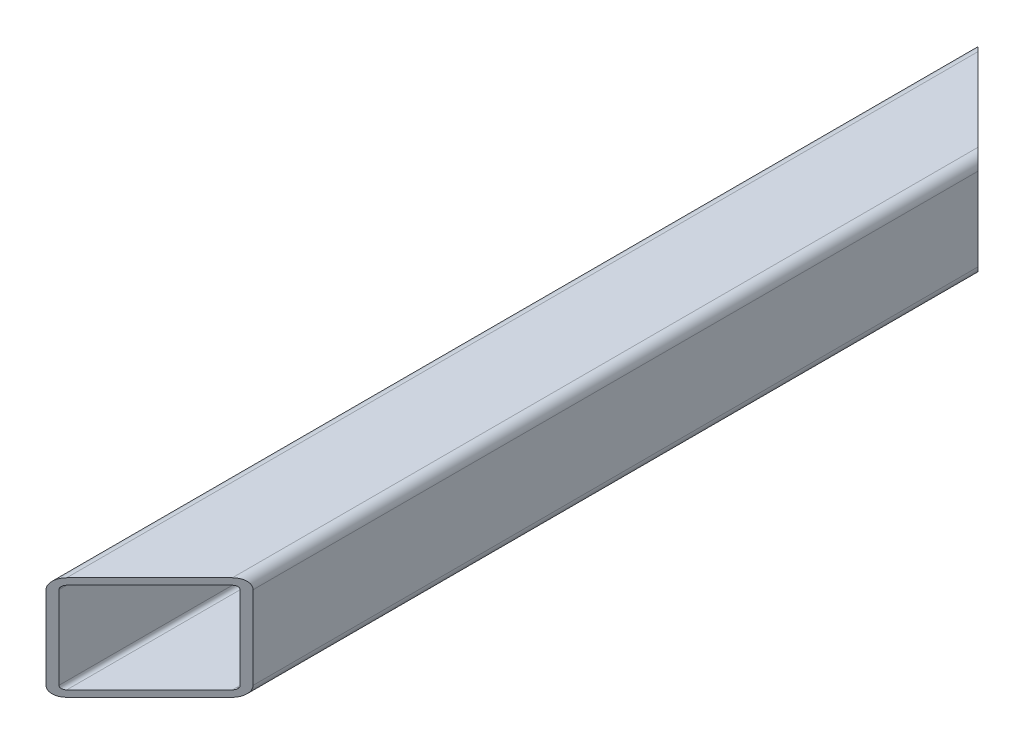
ISO-10303-21;
HEADER;
FILE_DESCRIPTION(('STEP AP214'),'2;1');
FILE_NAME('part.step','',(''),(''),'','','');
FILE_SCHEMA(('AUTOMOTIVE_DESIGN { 1 0 10303 214 1 1 1 1 }'));
ENDSEC;
DATA;
#1=APPLICATION_CONTEXT('core data for automotive mechanical design processes');
#2=APPLICATION_PROTOCOL_DEFINITION('international standard','automotive_design',2000,#1);
#3=PRODUCT_CONTEXT('',#1,'mechanical');
#4=PRODUCT('Part','Part','',(#3));
#5=PRODUCT_RELATED_PRODUCT_CATEGORY('part','',(#4));
#6=PRODUCT_DEFINITION_FORMATION('','',#4);
#7=PRODUCT_DEFINITION_CONTEXT('part definition',#1,'design');
#8=PRODUCT_DEFINITION('design','',#6,#7);
#9=PRODUCT_DEFINITION_SHAPE('','',#8);
#10=(LENGTH_UNIT() NAMED_UNIT(*) SI_UNIT(.MILLI.,.METRE.));
#11=(NAMED_UNIT(*) PLANE_ANGLE_UNIT() SI_UNIT($,.RADIAN.));
#12=(NAMED_UNIT(*) SI_UNIT($,.STERADIAN.) SOLID_ANGLE_UNIT());
#13=UNCERTAINTY_MEASURE_WITH_UNIT(LENGTH_MEASURE(1.E-05),#10,'distance_accuracy_value','');
#14=(GEOMETRIC_REPRESENTATION_CONTEXT(3) GLOBAL_UNCERTAINTY_ASSIGNED_CONTEXT((#13)) GLOBAL_UNIT_ASSIGNED_CONTEXT((#10,
#11,#12)) REPRESENTATION_CONTEXT('',''));
#15=CARTESIAN_POINT('',(0.,0.,0.));
#16=DIRECTION('',(0.,0.,1.));
#17=DIRECTION('',(1.,0.,0.));
#18=AXIS2_PLACEMENT_3D('',#15,#16,#17);
#19=CARTESIAN_POINT('',(8.,8.,-720.));
#20=DIRECTION('',(0.,0.,1.));
#21=DIRECTION('',(1.,0.,0.));
#22=AXIS2_PLACEMENT_3D('',#19,#20,#21);
#23=CYLINDRICAL_SURFACE('',#22,8.);
#24=CARTESIAN_POINT('',(8.,8.,-712.));
#25=DIRECTION('',(-0.707106781186548,0.,0.707106781186547));
#26=DIRECTION('',(0.707106781186547,0.,0.707106781186548));
#27=AXIS2_PLACEMENT_3D('',#24,#25,#26);
#28=ELLIPSE('',#27,11.3137084989848,8.);
#29=CARTESIAN_POINT('',(8.00000000000002,0.,-712.));
#30=VERTEX_POINT('',#29);
#31=CARTESIAN_POINT('',(0.,8.00000000000006,-720.));
#32=VERTEX_POINT('',#31);
#33=EDGE_CURVE('E151',#30,#32,#28,.F.);
#34=ORIENTED_EDGE('',*,*,#33,.F.);
#35=DIRECTION('',(0.,0.,1.));
#36=VECTOR('',#35,1.);
#37=CARTESIAN_POINT('',(8.00000000000006,0.,-720.));
#38=LINE('',#37,#36);
#39=CARTESIAN_POINT('',(8.00000000000001,0.,-8.00000000000004));
#40=VERTEX_POINT('',#39);
#41=EDGE_CURVE('E156',#30,#40,#38,.T.);
#42=ORIENTED_EDGE('',*,*,#41,.T.);
#43=CARTESIAN_POINT('',(8.,8.,-8.00000000000012));
#44=DIRECTION('',(-0.707106781186548,0.,-0.707106781186547));
#45=DIRECTION('',(-0.707106781186547,0.,0.707106781186548));
#46=AXIS2_PLACEMENT_3D('',#43,#44,#45);
#47=ELLIPSE('',#46,11.3137084989848,8.);
#48=CARTESIAN_POINT('',(0.,8.,0.));
#49=VERTEX_POINT('',#48);
#50=EDGE_CURVE('E217',#49,#40,#47,.F.);
#51=ORIENTED_EDGE('',*,*,#50,.F.);
#52=DIRECTION('',(0.,0.,1.));
#53=VECTOR('',#52,1.);
#54=CARTESIAN_POINT('',(0.,8.00000000000006,-720.));
#55=LINE('',#54,#53);
#56=EDGE_CURVE('E170',#32,#49,#55,.T.);
#57=ORIENTED_EDGE('',*,*,#56,.F.);
#58=EDGE_LOOP('',(#34,#42,#51,#57));
#59=FACE_BOUND('',#58,.T.);
#60=ADVANCED_FACE('F33',(#59),#23,.T.);
#61=CARTESIAN_POINT('',(0.,8.00000000000006,-720.));
#62=DIRECTION('',(-1.,0.,0.));
#63=DIRECTION('',(0.,0.,1.));
#64=AXIS2_PLACEMENT_3D('',#61,#62,#63);
#65=PLANE('',#64);
#66=DIRECTION('',(0.,-1.,0.));
#67=VECTOR('',#66,1.);
#68=CARTESIAN_POINT('',(0.,8.00000000000006,0.));
#69=LINE('',#68,#67);
#70=CARTESIAN_POINT('',(0.,71.9999999999999,0.));
#71=VERTEX_POINT('',#70);
#72=EDGE_CURVE('E157',#71,#49,#69,.T.);
#73=ORIENTED_EDGE('',*,*,#72,.F.);
#74=DIRECTION('',(0.,0.,1.));
#75=VECTOR('',#74,1.);
#76=CARTESIAN_POINT('',(0.,71.9999999999999,-720.));
#77=LINE('',#76,#75);
#78=CARTESIAN_POINT('',(0.,71.9999999999999,-720.));
#79=VERTEX_POINT('',#78);
#80=EDGE_CURVE('E164',#79,#71,#77,.T.);
#81=ORIENTED_EDGE('',*,*,#80,.F.);
#82=DIRECTION('',(0.,-1.,0.));
#83=VECTOR('',#82,1.);
#84=CARTESIAN_POINT('',(0.,8.00000000000006,-720.));
#85=LINE('',#84,#83);
#86=EDGE_CURVE('E145',#79,#32,#85,.T.);
#87=ORIENTED_EDGE('',*,*,#86,.T.);
#88=ORIENTED_EDGE('',*,*,#56,.T.);
#89=EDGE_LOOP('',(#73,#81,#87,#88));
#90=FACE_BOUND('',#89,.T.);
#91=ADVANCED_FACE('F169',(#90),#65,.T.);
#92=CARTESIAN_POINT('',(8.,72.,-720.));
#93=DIRECTION('',(0.,0.,1.));
#94=DIRECTION('',(1.,0.,0.));
#95=AXIS2_PLACEMENT_3D('',#92,#93,#94);
#96=CYLINDRICAL_SURFACE('',#95,8.);
#97=CARTESIAN_POINT('',(8.,72.,-712.));
#98=DIRECTION('',(-0.707106781186548,0.,0.707106781186547));
#99=DIRECTION('',(0.707106781186547,0.,0.707106781186548));
#100=AXIS2_PLACEMENT_3D('',#97,#98,#99);
#101=ELLIPSE('',#100,11.3137084989848,8.);
#102=CARTESIAN_POINT('',(8.00000000000002,80.,-712.));
#103=VERTEX_POINT('',#102);
#104=EDGE_CURVE('E148',#79,#103,#101,.F.);
#105=ORIENTED_EDGE('',*,*,#104,.F.);
#106=ORIENTED_EDGE('',*,*,#80,.T.);
#107=CARTESIAN_POINT('',(8.,72.,-7.9999999999999));
#108=DIRECTION('',(-0.707106781186548,0.,-0.707106781186547));
#109=DIRECTION('',(-0.707106781186547,0.,0.707106781186548));
#110=AXIS2_PLACEMENT_3D('',#107,#108,#109);
#111=ELLIPSE('',#110,11.3137084989848,8.);
#112=CARTESIAN_POINT('',(8.00000000000002,80.,-8.00000000000004));
#113=VERTEX_POINT('',#112);
#114=EDGE_CURVE('E215',#113,#71,#111,.F.);
#115=ORIENTED_EDGE('',*,*,#114,.F.);
#116=DIRECTION('',(0.,0.,1.));
#117=VECTOR('',#116,1.);
#118=CARTESIAN_POINT('',(8.00000000000006,80.,-720.));
#119=LINE('',#118,#117);
#120=EDGE_CURVE('E166',#103,#113,#119,.T.);
#121=ORIENTED_EDGE('',*,*,#120,.F.);
#122=EDGE_LOOP('',(#105,#106,#115,#121));
#123=FACE_BOUND('',#122,.T.);
#124=ADVANCED_FACE('F162',(#123),#96,.T.);
#125=CARTESIAN_POINT('',(8.00000000000006,80.,-720.));
#126=DIRECTION('',(0.,1.,0.));
#127=DIRECTION('',(-1.,0.,0.));
#128=AXIS2_PLACEMENT_3D('',#125,#126,#127);
#129=PLANE('',#128);
#130=DIRECTION('',(0.707106781186547,0.,0.707106781186548));
#131=VECTOR('',#130,1.);
#132=CARTESIAN_POINT('',(80.,80.,-640.));
#133=LINE('',#132,#131);
#134=CARTESIAN_POINT('',(72.,80.,-648.));
#135=VERTEX_POINT('',#134);
#136=EDGE_CURVE('E308',#103,#135,#133,.T.);
#137=ORIENTED_EDGE('',*,*,#136,.F.);
#138=ORIENTED_EDGE('',*,*,#120,.T.);
#139=DIRECTION('',(-0.707106781186547,0.,0.707106781186548));
#140=VECTOR('',#139,1.);
#141=CARTESIAN_POINT('',(80.,80.,-80.));
#142=LINE('',#141,#140);
#143=CARTESIAN_POINT('',(72.0000000000001,80.,-72.0000000000004));
#144=VERTEX_POINT('',#143);
#145=EDGE_CURVE('E247',#144,#113,#142,.T.);
#146=ORIENTED_EDGE('',*,*,#145,.F.);
#147=DIRECTION('',(0.,0.,1.));
#148=VECTOR('',#147,1.);
#149=CARTESIAN_POINT('',(71.9999999999999,80.,-720.));
#150=LINE('',#149,#148);
#151=EDGE_CURVE('E173',#135,#144,#150,.T.);
#152=ORIENTED_EDGE('',*,*,#151,.F.);
#153=EDGE_LOOP('',(#137,#138,#146,#152));
#154=FACE_BOUND('',#153,.T.);
#155=ADVANCED_FACE('F320',(#154),#129,.T.);
#156=CARTESIAN_POINT('',(72.,72.,-720.));
#157=DIRECTION('',(0.,0.,1.));
#158=DIRECTION('',(1.,0.,0.));
#159=AXIS2_PLACEMENT_3D('',#156,#157,#158);
#160=CYLINDRICAL_SURFACE('',#159,8.00000000000001);
#161=CARTESIAN_POINT('',(72.,72.,-648.));
#162=DIRECTION('',(-0.707106781186548,0.,0.707106781186547));
#163=DIRECTION('',(0.707106781186547,0.,0.707106781186548));
#164=AXIS2_PLACEMENT_3D('',#161,#162,#163);
#165=ELLIPSE('',#164,11.3137084989848,8.00000000000001);
#166=CARTESIAN_POINT('',(80.,71.9999999999999,-640.));
#167=VERTEX_POINT('',#166);
#168=EDGE_CURVE('E167',#135,#167,#165,.F.);
#169=ORIENTED_EDGE('',*,*,#168,.F.);
#170=ORIENTED_EDGE('',*,*,#151,.T.);
#171=CARTESIAN_POINT('',(72.,72.,-72.0000000000001));
#172=DIRECTION('',(-0.707106781186548,0.,-0.707106781186547));
#173=DIRECTION('',(-0.707106781186547,0.,0.707106781186548));
#174=AXIS2_PLACEMENT_3D('',#171,#172,#173);
#175=ELLIPSE('',#174,11.3137084989848,8.00000000000001);
#176=CARTESIAN_POINT('',(80.,71.9999999999999,-80.));
#177=VERTEX_POINT('',#176);
#178=EDGE_CURVE('E207',#177,#144,#175,.F.);
#179=ORIENTED_EDGE('',*,*,#178,.F.);
#180=DIRECTION('',(0.,0.,1.));
#181=VECTOR('',#180,1.);
#182=CARTESIAN_POINT('',(80.,71.9999999999999,-720.));
#183=LINE('',#182,#181);
#184=EDGE_CURVE('E178',#167,#177,#183,.T.);
#185=ORIENTED_EDGE('',*,*,#184,.F.);
#186=EDGE_LOOP('',(#169,#170,#179,#185));
#187=FACE_BOUND('',#186,.T.);
#188=ADVANCED_FACE('F317',(#187),#160,.T.);
#189=CARTESIAN_POINT('',(80.,8.00000000000006,-720.));
#190=DIRECTION('',(1.,0.,0.));
#191=DIRECTION('',(0.,1.,0.));
#192=AXIS2_PLACEMENT_3D('',#189,#190,#191);
#193=PLANE('',#192);
#194=DIRECTION('',(0.,1.,0.));
#195=VECTOR('',#194,1.);
#196=CARTESIAN_POINT('',(80.,0.,-640.));
#197=LINE('',#196,#195);
#198=CARTESIAN_POINT('',(80.,8.,-640.));
#199=VERTEX_POINT('',#198);
#200=EDGE_CURVE('E289',#199,#167,#197,.T.);
#201=ORIENTED_EDGE('',*,*,#200,.T.);
#202=ORIENTED_EDGE('',*,*,#184,.T.);
#203=DIRECTION('',(0.,1.,0.));
#204=VECTOR('',#203,1.);
#205=CARTESIAN_POINT('',(79.9999999999999,0.,-80.));
#206=LINE('',#205,#204);
#207=CARTESIAN_POINT('',(79.9999999999999,8.,-80.));
#208=VERTEX_POINT('',#207);
#209=EDGE_CURVE('E246',#208,#177,#206,.T.);
#210=ORIENTED_EDGE('',*,*,#209,.F.);
#211=DIRECTION('',(0.,0.,1.));
#212=VECTOR('',#211,1.);
#213=CARTESIAN_POINT('',(80.,8.00000000000006,-720.));
#214=LINE('',#213,#212);
#215=EDGE_CURVE('E180',#199,#208,#214,.T.);
#216=ORIENTED_EDGE('',*,*,#215,.F.);
#217=EDGE_LOOP('',(#201,#202,#210,#216));
#218=FACE_BOUND('',#217,.T.);
#219=ADVANCED_FACE('F314',(#218),#193,.T.);
#220=CARTESIAN_POINT('',(72.,8.,-720.));
#221=DIRECTION('',(0.,0.,1.));
#222=DIRECTION('',(1.,0.,0.));
#223=AXIS2_PLACEMENT_3D('',#220,#221,#222);
#224=CYLINDRICAL_SURFACE('',#223,8.);
#225=CARTESIAN_POINT('',(72.,8.,-648.));
#226=DIRECTION('',(-0.707106781186548,0.,0.707106781186547));
#227=DIRECTION('',(0.707106781186547,0.,0.707106781186548));
#228=AXIS2_PLACEMENT_3D('',#225,#226,#227);
#229=ELLIPSE('',#228,11.3137084989848,8.);
#230=CARTESIAN_POINT('',(72.,0.,-648.));
#231=VERTEX_POINT('',#230);
#232=EDGE_CURVE('E304',#199,#231,#229,.F.);
#233=ORIENTED_EDGE('',*,*,#232,.F.);
#234=ORIENTED_EDGE('',*,*,#215,.T.);
#235=CARTESIAN_POINT('',(72.,8.,-72.0000000000001));
#236=DIRECTION('',(-0.707106781186548,0.,-0.707106781186547));
#237=DIRECTION('',(-0.707106781186547,0.,0.707106781186548));
#238=AXIS2_PLACEMENT_3D('',#235,#236,#237);
#239=ELLIPSE('',#238,11.3137084989848,8.);
#240=CARTESIAN_POINT('',(71.9999999999999,0.,-72.));
#241=VERTEX_POINT('',#240);
#242=EDGE_CURVE('E203',#241,#208,#239,.F.);
#243=ORIENTED_EDGE('',*,*,#242,.F.);
#244=DIRECTION('',(0.,0.,1.));
#245=VECTOR('',#244,1.);
#246=CARTESIAN_POINT('',(71.9999999999999,0.,-720.));
#247=LINE('',#246,#245);
#248=EDGE_CURVE('E182',#231,#241,#247,.T.);
#249=ORIENTED_EDGE('',*,*,#248,.F.);
#250=EDGE_LOOP('',(#233,#234,#243,#249));
#251=FACE_BOUND('',#250,.T.);
#252=ADVANCED_FACE('F403',(#251),#224,.T.);
#253=CARTESIAN_POINT('',(8.00000000000006,0.,-720.));
#254=DIRECTION('',(0.,-1.,0.));
#255=DIRECTION('',(0.,0.,-1.));
#256=AXIS2_PLACEMENT_3D('',#253,#254,#255);
#257=PLANE('',#256);
#258=DIRECTION('',(0.707106781186547,0.,0.707106781186548));
#259=VECTOR('',#258,1.);
#260=CARTESIAN_POINT('',(80.,0.,-640.));
#261=LINE('',#260,#259);
#262=EDGE_CURVE('E242',#30,#231,#261,.T.);
#263=ORIENTED_EDGE('',*,*,#262,.T.);
#264=ORIENTED_EDGE('',*,*,#248,.T.);
#265=DIRECTION('',(-0.707106781186547,0.,0.707106781186548));
#266=VECTOR('',#265,1.);
#267=CARTESIAN_POINT('',(79.9999999999999,0.,-80.));
#268=LINE('',#267,#266);
#269=EDGE_CURVE('E244',#241,#40,#268,.T.);
#270=ORIENTED_EDGE('',*,*,#269,.T.);
#271=ORIENTED_EDGE('',*,*,#41,.F.);
#272=EDGE_LOOP('',(#263,#264,#270,#271));
#273=FACE_BOUND('',#272,.T.);
#274=ADVANCED_FACE('F241',(#273),#257,.T.);
#275=CARTESIAN_POINT('',(8.,8.,-720.));
#276=DIRECTION('',(0.,0.,1.));
#277=DIRECTION('',(1.,0.,0.));
#278=AXIS2_PLACEMENT_3D('',#275,#276,#277);
#279=CYLINDRICAL_SURFACE('',#278,3.);
#280=DIRECTION('',(0.,0.,1.));
#281=VECTOR('',#280,1.);
#282=CARTESIAN_POINT('',(8.00000000000006,5.,-720.));
#283=LINE('',#282,#281);
#284=CARTESIAN_POINT('',(8.00000000000004,5.,-712.));
#285=VERTEX_POINT('',#284);
#286=CARTESIAN_POINT('',(8.00000000000001,5.,-8.00000000000006));
#287=VERTEX_POINT('',#286);
#288=EDGE_CURVE('E189',#285,#287,#283,.T.);
#289=ORIENTED_EDGE('',*,*,#288,.F.);
#290=CARTESIAN_POINT('',(8.,8.,-712.));
#291=DIRECTION('',(-0.707106781186548,0.,0.707106781186547));
#292=DIRECTION('',(0.707106781186547,0.,0.707106781186548));
#293=AXIS2_PLACEMENT_3D('',#290,#291,#292);
#294=ELLIPSE('',#293,4.24264068711929,3.);
#295=CARTESIAN_POINT('',(5.,8.00000000000006,-715.));
#296=VERTEX_POINT('',#295);
#297=EDGE_CURVE('E47',#285,#296,#294,.F.);
#298=ORIENTED_EDGE('',*,*,#297,.T.);
#299=DIRECTION('',(0.,0.,1.));
#300=VECTOR('',#299,1.);
#301=CARTESIAN_POINT('',(5.,8.00000000000006,-720.));
#302=LINE('',#301,#300);
#303=CARTESIAN_POINT('',(5.,8.00000000000006,-5.));
#304=VERTEX_POINT('',#303);
#305=EDGE_CURVE('E202',#296,#304,#302,.T.);
#306=ORIENTED_EDGE('',*,*,#305,.T.);
#307=CARTESIAN_POINT('',(8.,8.,-8.00000000000012));
#308=DIRECTION('',(-0.707106781186548,0.,-0.707106781186547));
#309=DIRECTION('',(-0.707106781186547,0.,0.707106781186548));
#310=AXIS2_PLACEMENT_3D('',#307,#308,#309);
#311=ELLIPSE('',#310,4.24264068711929,3.);
#312=EDGE_CURVE('E195',#304,#287,#311,.F.);
#313=ORIENTED_EDGE('',*,*,#312,.T.);
#314=EDGE_LOOP('',(#289,#298,#306,#313));
#315=FACE_BOUND('',#314,.T.);
#316=ADVANCED_FACE('F200',(#315),#279,.F.);
#317=CARTESIAN_POINT('',(5.,8.00000000000006,-720.));
#318=DIRECTION('',(-1.,0.,0.));
#319=DIRECTION('',(0.,0.,1.));
#320=AXIS2_PLACEMENT_3D('',#317,#318,#319);
#321=PLANE('',#320);
#322=ORIENTED_EDGE('',*,*,#305,.F.);
#323=DIRECTION('',(0.,1.,0.));
#324=VECTOR('',#323,1.);
#325=CARTESIAN_POINT('',(5.,8.00000000000006,-715.));
#326=LINE('',#325,#324);
#327=CARTESIAN_POINT('',(5.,71.9999999999999,-715.));
#328=VERTEX_POINT('',#327);
#329=EDGE_CURVE('E300',#296,#328,#326,.T.);
#330=ORIENTED_EDGE('',*,*,#329,.T.);
#331=DIRECTION('',(0.,0.,1.));
#332=VECTOR('',#331,1.);
#333=CARTESIAN_POINT('',(5.,71.9999999999999,-720.));
#334=LINE('',#333,#332);
#335=CARTESIAN_POINT('',(5.,71.9999999999999,-5.));
#336=VERTEX_POINT('',#335);
#337=EDGE_CURVE('E221',#328,#336,#334,.T.);
#338=ORIENTED_EDGE('',*,*,#337,.T.);
#339=DIRECTION('',(0.,-1.,0.));
#340=VECTOR('',#339,1.);
#341=CARTESIAN_POINT('',(5.,7.9999999999999,-5.));
#342=LINE('',#341,#340);
#343=EDGE_CURVE('E204',#336,#304,#342,.T.);
#344=ORIENTED_EDGE('',*,*,#343,.T.);
#345=EDGE_LOOP('',(#322,#330,#338,#344));
#346=FACE_BOUND('',#345,.T.);
#347=ADVANCED_FACE('F340',(#346),#321,.F.);
#348=CARTESIAN_POINT('',(8.,72.,-720.));
#349=DIRECTION('',(0.,0.,1.));
#350=DIRECTION('',(1.,0.,0.));
#351=AXIS2_PLACEMENT_3D('',#348,#349,#350);
#352=CYLINDRICAL_SURFACE('',#351,3.);
#353=ORIENTED_EDGE('',*,*,#337,.F.);
#354=CARTESIAN_POINT('',(8.,72.,-712.));
#355=DIRECTION('',(-0.707106781186548,0.,0.707106781186547));
#356=DIRECTION('',(0.707106781186547,0.,0.707106781186548));
#357=AXIS2_PLACEMENT_3D('',#354,#355,#356);
#358=ELLIPSE('',#357,4.24264068711929,3.);
#359=CARTESIAN_POINT('',(8.00000000000002,75.,-712.));
#360=VERTEX_POINT('',#359);
#361=EDGE_CURVE('E298',#328,#360,#358,.F.);
#362=ORIENTED_EDGE('',*,*,#361,.T.);
#363=DIRECTION('',(0.,0.,1.));
#364=VECTOR('',#363,1.);
#365=CARTESIAN_POINT('',(8.00000000000002,75.,-720.));
#366=LINE('',#365,#364);
#367=CARTESIAN_POINT('',(8.00000000000006,75.,-8.00000000000017));
#368=VERTEX_POINT('',#367);
#369=EDGE_CURVE('E223',#360,#368,#366,.T.);
#370=ORIENTED_EDGE('',*,*,#369,.T.);
#371=CARTESIAN_POINT('',(8.,72.,-7.9999999999999));
#372=DIRECTION('',(-0.707106781186548,0.,-0.707106781186547));
#373=DIRECTION('',(-0.707106781186547,0.,0.707106781186548));
#374=AXIS2_PLACEMENT_3D('',#371,#372,#373);
#375=ELLIPSE('',#374,4.24264068711929,3.);
#376=EDGE_CURVE('E209',#368,#336,#375,.F.);
#377=ORIENTED_EDGE('',*,*,#376,.T.);
#378=EDGE_LOOP('',(#353,#362,#370,#377));
#379=FACE_BOUND('',#378,.T.);
#380=ADVANCED_FACE('F267',(#379),#352,.F.);
#381=CARTESIAN_POINT('',(8.00000000000002,75.,-720.));
#382=DIRECTION('',(0.,1.,0.));
#383=DIRECTION('',(0.,0.,1.));
#384=AXIS2_PLACEMENT_3D('',#381,#382,#383);
#385=PLANE('',#384);
#386=ORIENTED_EDGE('',*,*,#369,.F.);
#387=DIRECTION('',(0.707106781186547,0.,0.707106781186548));
#388=VECTOR('',#387,1.);
#389=CARTESIAN_POINT('',(4.00000000000001,75.,-716.));
#390=LINE('',#389,#388);
#391=CARTESIAN_POINT('',(71.9999999999999,75.,-648.));
#392=VERTEX_POINT('',#391);
#393=EDGE_CURVE('E276',#360,#392,#390,.T.);
#394=ORIENTED_EDGE('',*,*,#393,.T.);
#395=DIRECTION('',(0.,0.,1.));
#396=VECTOR('',#395,1.);
#397=CARTESIAN_POINT('',(71.9999999999999,75.,-720.));
#398=LINE('',#397,#396);
#399=CARTESIAN_POINT('',(71.9999999999999,75.,-72.0000000000001));
#400=VERTEX_POINT('',#399);
#401=EDGE_CURVE('E225',#392,#400,#398,.T.);
#402=ORIENTED_EDGE('',*,*,#401,.T.);
#403=DIRECTION('',(-0.707106781186547,0.,0.707106781186548));
#404=VECTOR('',#403,1.);
#405=CARTESIAN_POINT('',(364.,75.,-364.));
#406=LINE('',#405,#404);
#407=EDGE_CURVE('E261',#400,#368,#406,.T.);
#408=ORIENTED_EDGE('',*,*,#407,.T.);
#409=EDGE_LOOP('',(#386,#394,#402,#408));
#410=FACE_BOUND('',#409,.T.);
#411=ADVANCED_FACE('F273',(#410),#385,.F.);
#412=CARTESIAN_POINT('',(72.,72.,-720.));
#413=DIRECTION('',(0.,0.,1.));
#414=DIRECTION('',(1.,0.,0.));
#415=AXIS2_PLACEMENT_3D('',#412,#413,#414);
#416=CYLINDRICAL_SURFACE('',#415,3.00000000000001);
#417=ORIENTED_EDGE('',*,*,#401,.F.);
#418=CARTESIAN_POINT('',(72.,72.,-648.));
#419=DIRECTION('',(-0.707106781186548,0.,0.707106781186547));
#420=DIRECTION('',(0.707106781186547,0.,0.707106781186548));
#421=AXIS2_PLACEMENT_3D('',#418,#419,#420);
#422=ELLIPSE('',#421,4.2426406871193,3.00000000000001);
#423=CARTESIAN_POINT('',(75.,72.,-645.));
#424=VERTEX_POINT('',#423);
#425=EDGE_CURVE('E280',#392,#424,#422,.F.);
#426=ORIENTED_EDGE('',*,*,#425,.T.);
#427=DIRECTION('',(0.,0.,1.));
#428=VECTOR('',#427,1.);
#429=CARTESIAN_POINT('',(75.,72.,-720.));
#430=LINE('',#429,#428);
#431=CARTESIAN_POINT('',(75.,72.,-75.));
#432=VERTEX_POINT('',#431);
#433=EDGE_CURVE('E227',#424,#432,#430,.T.);
#434=ORIENTED_EDGE('',*,*,#433,.T.);
#435=CARTESIAN_POINT('',(72.,72.,-72.0000000000001));
#436=DIRECTION('',(-0.707106781186548,0.,-0.707106781186547));
#437=DIRECTION('',(-0.707106781186547,0.,0.707106781186548));
#438=AXIS2_PLACEMENT_3D('',#435,#436,#437);
#439=ELLIPSE('',#438,4.2426406871193,3.00000000000001);
#440=EDGE_CURVE('E258',#432,#400,#439,.F.);
#441=ORIENTED_EDGE('',*,*,#440,.T.);
#442=EDGE_LOOP('',(#417,#426,#434,#441));
#443=FACE_BOUND('',#442,.T.);
#444=ADVANCED_FACE('F279',(#443),#416,.F.);
#445=CARTESIAN_POINT('',(75.,8.00000000000006,-720.));
#446=DIRECTION('',(1.,0.,0.));
#447=DIRECTION('',(0.,1.,0.));
#448=AXIS2_PLACEMENT_3D('',#445,#446,#447);
#449=PLANE('',#448);
#450=ORIENTED_EDGE('',*,*,#433,.F.);
#451=DIRECTION('',(0.,-1.,0.));
#452=VECTOR('',#451,1.);
#453=CARTESIAN_POINT('',(75.,8.00000000000009,-645.));
#454=LINE('',#453,#452);
#455=CARTESIAN_POINT('',(75.,8.00000000000006,-645.));
#456=VERTEX_POINT('',#455);
#457=EDGE_CURVE('E286',#424,#456,#454,.T.);
#458=ORIENTED_EDGE('',*,*,#457,.T.);
#459=DIRECTION('',(0.,0.,1.));
#460=VECTOR('',#459,1.);
#461=CARTESIAN_POINT('',(75.,8.00000000000006,-720.));
#462=LINE('',#461,#460);
#463=CARTESIAN_POINT('',(75.,8.00000000000006,-75.0000000000002));
#464=VERTEX_POINT('',#463);
#465=EDGE_CURVE('E229',#456,#464,#462,.T.);
#466=ORIENTED_EDGE('',*,*,#465,.T.);
#467=DIRECTION('',(0.,1.,0.));
#468=VECTOR('',#467,1.);
#469=CARTESIAN_POINT('',(75.,7.99999999999978,-75.0000000000001));
#470=LINE('',#469,#468);
#471=EDGE_CURVE('E255',#464,#432,#470,.T.);
#472=ORIENTED_EDGE('',*,*,#471,.T.);
#473=EDGE_LOOP('',(#450,#458,#466,#472));
#474=FACE_BOUND('',#473,.T.);
#475=ADVANCED_FACE('F283',(#474),#449,.F.);
#476=CARTESIAN_POINT('',(72.,8.,-720.));
#477=DIRECTION('',(0.,0.,1.));
#478=DIRECTION('',(1.,0.,0.));
#479=AXIS2_PLACEMENT_3D('',#476,#477,#478);
#480=CYLINDRICAL_SURFACE('',#479,3.);
#481=ORIENTED_EDGE('',*,*,#465,.F.);
#482=CARTESIAN_POINT('',(72.,8.,-648.));
#483=DIRECTION('',(-0.707106781186548,0.,0.707106781186547));
#484=DIRECTION('',(0.707106781186547,0.,0.707106781186548));
#485=AXIS2_PLACEMENT_3D('',#482,#483,#484);
#486=ELLIPSE('',#485,4.24264068711929,3.);
#487=CARTESIAN_POINT('',(72.,5.,-648.));
#488=VERTEX_POINT('',#487);
#489=EDGE_CURVE('E288',#456,#488,#486,.F.);
#490=ORIENTED_EDGE('',*,*,#489,.T.);
#491=DIRECTION('',(0.,0.,1.));
#492=VECTOR('',#491,1.);
#493=CARTESIAN_POINT('',(72.,5.,-720.));
#494=LINE('',#493,#492);
#495=CARTESIAN_POINT('',(72.,5.,-72.));
#496=VERTEX_POINT('',#495);
#497=EDGE_CURVE('E54',#488,#496,#494,.T.);
#498=ORIENTED_EDGE('',*,*,#497,.T.);
#499=CARTESIAN_POINT('',(72.,8.,-72.0000000000001));
#500=DIRECTION('',(-0.707106781186548,0.,-0.707106781186547));
#501=DIRECTION('',(-0.707106781186547,0.,0.707106781186548));
#502=AXIS2_PLACEMENT_3D('',#499,#500,#501);
#503=ELLIPSE('',#502,4.24264068711929,3.);
#504=EDGE_CURVE('E198',#496,#464,#503,.F.);
#505=ORIENTED_EDGE('',*,*,#504,.T.);
#506=EDGE_LOOP('',(#481,#490,#498,#505));
#507=FACE_BOUND('',#506,.T.);
#508=ADVANCED_FACE('F287',(#507),#480,.F.);
#509=CARTESIAN_POINT('',(8.00000000000006,5.,-720.));
#510=DIRECTION('',(0.,-1.,0.));
#511=DIRECTION('',(1.,0.,0.));
#512=AXIS2_PLACEMENT_3D('',#509,#510,#511);
#513=PLANE('',#512);
#514=ORIENTED_EDGE('',*,*,#497,.F.);
#515=DIRECTION('',(-0.707106781186547,0.,-0.707106781186548));
#516=VECTOR('',#515,1.);
#517=CARTESIAN_POINT('',(4.00000000000002,5.,-716.));
#518=LINE('',#517,#516);
#519=EDGE_CURVE('E11',#488,#285,#518,.T.);
#520=ORIENTED_EDGE('',*,*,#519,.T.);
#521=ORIENTED_EDGE('',*,*,#288,.T.);
#522=DIRECTION('',(0.707106781186547,0.,-0.707106781186548));
#523=VECTOR('',#522,1.);
#524=CARTESIAN_POINT('',(364.,4.99999999999998,-364.));
#525=LINE('',#524,#523);
#526=EDGE_CURVE('E40',#287,#496,#525,.T.);
#527=ORIENTED_EDGE('',*,*,#526,.T.);
#528=EDGE_LOOP('',(#514,#520,#521,#527));
#529=FACE_BOUND('',#528,.T.);
#530=ADVANCED_FACE('F187',(#529),#513,.F.);
#531=CARTESIAN_POINT('',(79.9999999999999,0.,-80.));
#532=DIRECTION('',(-0.707106781186548,0.,-0.707106781186547));
#533=DIRECTION('',(-0.707106781186547,0.,0.707106781186548));
#534=AXIS2_PLACEMENT_3D('',#531,#532,#533);
#535=PLANE('',#534);
#536=ORIENTED_EDGE('',*,*,#50,.T.);
#537=ORIENTED_EDGE('',*,*,#269,.F.);
#538=ORIENTED_EDGE('',*,*,#242,.T.);
#539=ORIENTED_EDGE('',*,*,#209,.T.);
#540=ORIENTED_EDGE('',*,*,#178,.T.);
#541=ORIENTED_EDGE('',*,*,#145,.T.);
#542=ORIENTED_EDGE('',*,*,#114,.T.);
#543=ORIENTED_EDGE('',*,*,#72,.T.);
#544=EDGE_LOOP('',(#536,#537,#538,#539,#540,#541,#542,#543));
#545=FACE_BOUND('',#544,.T.);
#546=ORIENTED_EDGE('',*,*,#343,.F.);
#547=ORIENTED_EDGE('',*,*,#376,.F.);
#548=ORIENTED_EDGE('',*,*,#407,.F.);
#549=ORIENTED_EDGE('',*,*,#440,.F.);
#550=ORIENTED_EDGE('',*,*,#471,.F.);
#551=ORIENTED_EDGE('',*,*,#504,.F.);
#552=ORIENTED_EDGE('',*,*,#526,.F.);
#553=ORIENTED_EDGE('',*,*,#312,.F.);
#554=EDGE_LOOP('',(#546,#547,#548,#549,#550,#551,#552,#553));
#555=FACE_BOUND('',#554,.T.);
#556=ADVANCED_FACE('F194',(#545,#555),#535,.F.);
#557=CARTESIAN_POINT('',(80.,0.,-640.));
#558=DIRECTION('',(-0.707106781186548,0.,0.707106781186547));
#559=DIRECTION('',(0.707106781186547,0.,0.707106781186548));
#560=AXIS2_PLACEMENT_3D('',#557,#558,#559);
#561=PLANE('',#560);
#562=ORIENTED_EDGE('',*,*,#33,.T.);
#563=ORIENTED_EDGE('',*,*,#86,.F.);
#564=ORIENTED_EDGE('',*,*,#104,.T.);
#565=ORIENTED_EDGE('',*,*,#136,.T.);
#566=ORIENTED_EDGE('',*,*,#168,.T.);
#567=ORIENTED_EDGE('',*,*,#200,.F.);
#568=ORIENTED_EDGE('',*,*,#232,.T.);
#569=ORIENTED_EDGE('',*,*,#262,.F.);
#570=EDGE_LOOP('',(#562,#563,#564,#565,#566,#567,#568,#569));
#571=FACE_BOUND('',#570,.T.);
#572=ORIENTED_EDGE('',*,*,#519,.F.);
#573=ORIENTED_EDGE('',*,*,#489,.F.);
#574=ORIENTED_EDGE('',*,*,#457,.F.);
#575=ORIENTED_EDGE('',*,*,#425,.F.);
#576=ORIENTED_EDGE('',*,*,#393,.F.);
#577=ORIENTED_EDGE('',*,*,#361,.F.);
#578=ORIENTED_EDGE('',*,*,#329,.F.);
#579=ORIENTED_EDGE('',*,*,#297,.F.);
#580=EDGE_LOOP('',(#572,#573,#574,#575,#576,#577,#578,#579));
#581=FACE_BOUND('',#580,.T.);
#582=ADVANCED_FACE('F147',(#571,#581),#561,.F.);
#583=CLOSED_SHELL('',(#60,#91,#124,#155,#188,#219,#252,#274,#316,#347,#380,#411,#444,#475,#508,
#530,#556,#582));
#584=MANIFOLD_SOLID_BREP('B2',#583);
#585=ADVANCED_BREP_SHAPE_REPRESENTATION('',(#18,#584),#14);
#586=SHAPE_DEFINITION_REPRESENTATION(#9,#585);
ENDSEC;
END-ISO-10303-21;
